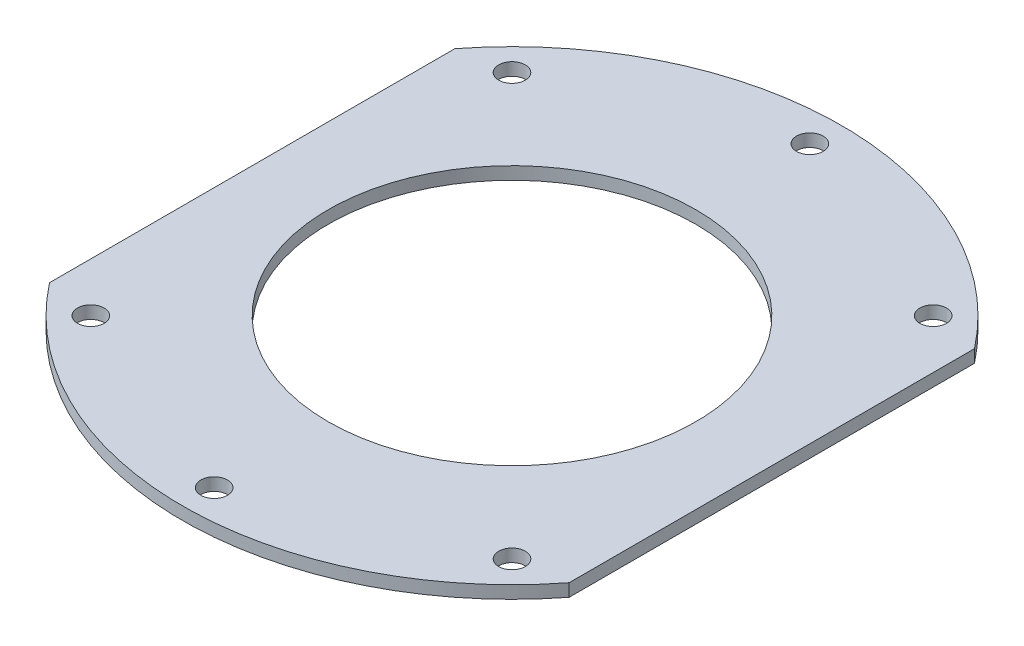
ISO-10303-21;
HEADER;
FILE_DESCRIPTION(('STEP AP214'),'2;1');
FILE_NAME('part.step','',(''),(''),'','','');
FILE_SCHEMA(('AUTOMOTIVE_DESIGN { 1 0 10303 214 1 1 1 1 }'));
ENDSEC;
DATA;
#1=APPLICATION_CONTEXT('core data for automotive mechanical design processes');
#2=APPLICATION_PROTOCOL_DEFINITION('international standard','automotive_design',2000,#1);
#3=PRODUCT_CONTEXT('',#1,'mechanical');
#4=PRODUCT('Part','Part','',(#3));
#5=PRODUCT_RELATED_PRODUCT_CATEGORY('part','',(#4));
#6=PRODUCT_DEFINITION_FORMATION('','',#4);
#7=PRODUCT_DEFINITION_CONTEXT('part definition',#1,'design');
#8=PRODUCT_DEFINITION('design','',#6,#7);
#9=PRODUCT_DEFINITION_SHAPE('','',#8);
#10=(LENGTH_UNIT() NAMED_UNIT(*) SI_UNIT(.MILLI.,.METRE.));
#11=(NAMED_UNIT(*) PLANE_ANGLE_UNIT() SI_UNIT($,.RADIAN.));
#12=(NAMED_UNIT(*) SI_UNIT($,.STERADIAN.) SOLID_ANGLE_UNIT());
#13=UNCERTAINTY_MEASURE_WITH_UNIT(LENGTH_MEASURE(1.E-05),#10,'distance_accuracy_value','');
#14=(GEOMETRIC_REPRESENTATION_CONTEXT(3) GLOBAL_UNCERTAINTY_ASSIGNED_CONTEXT((#13)) GLOBAL_UNIT_ASSIGNED_CONTEXT((#10,
#11,#12)) REPRESENTATION_CONTEXT('',''));
#15=CARTESIAN_POINT('',(0.,0.,0.));
#16=DIRECTION('',(0.,0.,1.));
#17=DIRECTION('',(1.,0.,0.));
#18=AXIS2_PLACEMENT_3D('',#15,#16,#17);
#19=CARTESIAN_POINT('',(0.,2.,0.));
#20=DIRECTION('',(0.,1.,0.));
#21=DIRECTION('',(0.,0.,1.));
#22=AXIS2_PLACEMENT_3D('',#19,#20,#21);
#23=PLANE('',#22);
#24=CARTESIAN_POINT('',(0.,2.,-47.));
#25=DIRECTION('',(0.,1.,0.));
#26=DIRECTION('',(0.,0.,1.));
#27=AXIS2_PLACEMENT_3D('',#24,#25,#26);
#28=CIRCLE('',#27,2.1);
#29=CARTESIAN_POINT('',(0.,2.,-44.9));
#30=VERTEX_POINT('',#29);
#31=EDGE_CURVE('E266',#30,#30,#28,.T.);
#32=ORIENTED_EDGE('',*,*,#31,.F.);
#33=EDGE_LOOP('',(#32));
#34=FACE_BOUND('',#33,.T.);
#35=CARTESIAN_POINT('',(0.,2.,47.));
#36=DIRECTION('',(0.,1.,0.));
#37=DIRECTION('',(0.,0.,1.));
#38=AXIS2_PLACEMENT_3D('',#35,#36,#37);
#39=CIRCLE('',#38,2.1);
#40=CARTESIAN_POINT('',(0.,2.,49.1));
#41=VERTEX_POINT('',#40);
#42=EDGE_CURVE('E284',#41,#41,#39,.T.);
#43=ORIENTED_EDGE('',*,*,#42,.F.);
#44=EDGE_LOOP('',(#43));
#45=FACE_BOUND('',#44,.T.);
#46=CARTESIAN_POINT('',(0.,2.,0.));
#47=DIRECTION('',(0.,1.,0.));
#48=DIRECTION('',(0.,0.,1.));
#49=AXIS2_PLACEMENT_3D('',#46,#47,#48);
#50=CIRCLE('',#49,29.);
#51=CARTESIAN_POINT('',(0.,2.,29.));
#52=VERTEX_POINT('',#51);
#53=EDGE_CURVE('E123',#52,#52,#50,.T.);
#54=ORIENTED_EDGE('',*,*,#53,.F.);
#55=EDGE_LOOP('',(#54));
#56=FACE_BOUND('',#55,.T.);
#57=CARTESIAN_POINT('',(33.2340187157677,2.,33.2340187157677));
#58=DIRECTION('',(0.,1.,0.));
#59=DIRECTION('',(0.,0.,1.));
#60=AXIS2_PLACEMENT_3D('',#57,#58,#59);
#61=CIRCLE('',#60,2.1);
#62=CARTESIAN_POINT('',(33.2340187157677,2.,35.3340187157677));
#63=VERTEX_POINT('',#62);
#64=EDGE_CURVE('E290',#63,#63,#61,.T.);
#65=ORIENTED_EDGE('',*,*,#64,.F.);
#66=EDGE_LOOP('',(#65));
#67=FACE_BOUND('',#66,.T.);
#68=CARTESIAN_POINT('',(-33.2340187157677,2.,33.2340187157677));
#69=DIRECTION('',(0.,1.,0.));
#70=DIRECTION('',(0.,0.,1.));
#71=AXIS2_PLACEMENT_3D('',#68,#69,#70);
#72=CIRCLE('',#71,2.1);
#73=CARTESIAN_POINT('',(-33.2340187157677,2.,35.3340187157677));
#74=VERTEX_POINT('',#73);
#75=EDGE_CURVE('E278',#74,#74,#72,.T.);
#76=ORIENTED_EDGE('',*,*,#75,.F.);
#77=EDGE_LOOP('',(#76));
#78=FACE_BOUND('',#77,.T.);
#79=CARTESIAN_POINT('',(-33.2340187157677,2.,-33.2340187157677));
#80=DIRECTION('',(0.,1.,0.));
#81=DIRECTION('',(0.,0.,1.));
#82=AXIS2_PLACEMENT_3D('',#79,#80,#81);
#83=CIRCLE('',#82,2.1);
#84=CARTESIAN_POINT('',(-33.2340187157677,2.,-31.1340187157677));
#85=VERTEX_POINT('',#84);
#86=EDGE_CURVE('E272',#85,#85,#83,.T.);
#87=ORIENTED_EDGE('',*,*,#86,.F.);
#88=EDGE_LOOP('',(#87));
#89=FACE_BOUND('',#88,.T.);
#90=CARTESIAN_POINT('',(33.2340187157677,2.,-33.2340187157677));
#91=DIRECTION('',(0.,1.,0.));
#92=DIRECTION('',(0.,0.,1.));
#93=AXIS2_PLACEMENT_3D('',#90,#91,#92);
#94=CIRCLE('',#93,2.1);
#95=CARTESIAN_POINT('',(33.2340187157677,2.,-31.1340187157677));
#96=VERTEX_POINT('',#95);
#97=EDGE_CURVE('E256',#96,#96,#94,.T.);
#98=ORIENTED_EDGE('',*,*,#97,.F.);
#99=EDGE_LOOP('',(#98));
#100=FACE_BOUND('',#99,.T.);
#101=CARTESIAN_POINT('',(0.,2.,0.));
#102=DIRECTION('',(0.,1.,0.));
#103=DIRECTION('',(0.,0.,1.));
#104=AXIS2_PLACEMENT_3D('',#101,#102,#103);
#105=CIRCLE('',#104,52.);
#106=CARTESIAN_POINT('',(-41.,2.,31.984371183439));
#107=VERTEX_POINT('',#106);
#108=CARTESIAN_POINT('',(41.,2.,31.984371183439));
#109=VERTEX_POINT('',#108);
#110=EDGE_CURVE('E109',#107,#109,#105,.T.);
#111=ORIENTED_EDGE('',*,*,#110,.T.);
#112=DIRECTION('',(0.,0.,-1.));
#113=VECTOR('',#112,1.);
#114=CARTESIAN_POINT('',(41.,2.,55.0176136765046));
#115=LINE('',#114,#113);
#116=CARTESIAN_POINT('',(41.,2.,-31.984371183439));
#117=VERTEX_POINT('',#116);
#118=EDGE_CURVE('E97',#109,#117,#115,.T.);
#119=ORIENTED_EDGE('',*,*,#118,.T.);
#120=CARTESIAN_POINT('',(-41.,2.,-31.984371183439));
#121=VERTEX_POINT('',#120);
#122=EDGE_CURVE('E113',#117,#121,#105,.T.);
#123=ORIENTED_EDGE('',*,*,#122,.T.);
#124=DIRECTION('',(0.,0.,1.));
#125=VECTOR('',#124,1.);
#126=CARTESIAN_POINT('',(-41.,2.,55.0176136765046));
#127=LINE('',#126,#125);
#128=EDGE_CURVE('E104',#121,#107,#127,.T.);
#129=ORIENTED_EDGE('',*,*,#128,.T.);
#130=EDGE_LOOP('',(#111,#119,#123,#129));
#131=FACE_BOUND('',#130,.T.);
#132=ADVANCED_FACE('F59',(#34,#45,#56,#67,#78,#89,#100,#131),#23,.T.);
#133=CARTESIAN_POINT('',(0.,0.,0.));
#134=DIRECTION('',(0.,1.,0.));
#135=DIRECTION('',(0.,0.,1.));
#136=AXIS2_PLACEMENT_3D('',#133,#134,#135);
#137=PLANE('',#136);
#138=CARTESIAN_POINT('',(0.,0.,0.));
#139=DIRECTION('',(0.,1.,0.));
#140=DIRECTION('',(0.,0.,1.));
#141=AXIS2_PLACEMENT_3D('',#138,#139,#140);
#142=CIRCLE('',#141,29.);
#143=CARTESIAN_POINT('',(0.,0.,29.));
#144=VERTEX_POINT('',#143);
#145=EDGE_CURVE('E120',#144,#144,#142,.T.);
#146=ORIENTED_EDGE('',*,*,#145,.T.);
#147=EDGE_LOOP('',(#146));
#148=FACE_BOUND('',#147,.T.);
#149=CARTESIAN_POINT('',(33.2340187157677,0.,33.2340187157677));
#150=DIRECTION('',(0.,1.,0.));
#151=DIRECTION('',(0.,0.,1.));
#152=AXIS2_PLACEMENT_3D('',#149,#150,#151);
#153=CIRCLE('',#152,2.1);
#154=CARTESIAN_POINT('',(33.2340187157677,0.,35.3340187157677));
#155=VERTEX_POINT('',#154);
#156=EDGE_CURVE('E287',#155,#155,#153,.T.);
#157=ORIENTED_EDGE('',*,*,#156,.T.);
#158=EDGE_LOOP('',(#157));
#159=FACE_BOUND('',#158,.T.);
#160=CARTESIAN_POINT('',(0.,0.,47.));
#161=DIRECTION('',(0.,1.,0.));
#162=DIRECTION('',(0.,0.,1.));
#163=AXIS2_PLACEMENT_3D('',#160,#161,#162);
#164=CIRCLE('',#163,2.1);
#165=CARTESIAN_POINT('',(0.,0.,49.1));
#166=VERTEX_POINT('',#165);
#167=EDGE_CURVE('E281',#166,#166,#164,.T.);
#168=ORIENTED_EDGE('',*,*,#167,.T.);
#169=EDGE_LOOP('',(#168));
#170=FACE_BOUND('',#169,.T.);
#171=CARTESIAN_POINT('',(-33.2340187157677,0.,33.2340187157677));
#172=DIRECTION('',(0.,1.,0.));
#173=DIRECTION('',(0.,0.,1.));
#174=AXIS2_PLACEMENT_3D('',#171,#172,#173);
#175=CIRCLE('',#174,2.1);
#176=CARTESIAN_POINT('',(-33.2340187157677,0.,35.3340187157677));
#177=VERTEX_POINT('',#176);
#178=EDGE_CURVE('E275',#177,#177,#175,.T.);
#179=ORIENTED_EDGE('',*,*,#178,.T.);
#180=EDGE_LOOP('',(#179));
#181=FACE_BOUND('',#180,.T.);
#182=CARTESIAN_POINT('',(-33.2340187157677,0.,-33.2340187157677));
#183=DIRECTION('',(0.,1.,0.));
#184=DIRECTION('',(0.,0.,1.));
#185=AXIS2_PLACEMENT_3D('',#182,#183,#184);
#186=CIRCLE('',#185,2.1);
#187=CARTESIAN_POINT('',(-33.2340187157677,0.,-31.1340187157677));
#188=VERTEX_POINT('',#187);
#189=EDGE_CURVE('E269',#188,#188,#186,.T.);
#190=ORIENTED_EDGE('',*,*,#189,.T.);
#191=EDGE_LOOP('',(#190));
#192=FACE_BOUND('',#191,.T.);
#193=CARTESIAN_POINT('',(0.,0.,-47.));
#194=DIRECTION('',(0.,1.,0.));
#195=DIRECTION('',(0.,0.,1.));
#196=AXIS2_PLACEMENT_3D('',#193,#194,#195);
#197=CIRCLE('',#196,2.1);
#198=CARTESIAN_POINT('',(0.,0.,-44.9));
#199=VERTEX_POINT('',#198);
#200=EDGE_CURVE('E262',#199,#199,#197,.T.);
#201=ORIENTED_EDGE('',*,*,#200,.T.);
#202=EDGE_LOOP('',(#201));
#203=FACE_BOUND('',#202,.T.);
#204=CARTESIAN_POINT('',(33.2340187157677,0.,-33.2340187157677));
#205=DIRECTION('',(0.,1.,0.));
#206=DIRECTION('',(0.,0.,1.));
#207=AXIS2_PLACEMENT_3D('',#204,#205,#206);
#208=CIRCLE('',#207,2.1);
#209=CARTESIAN_POINT('',(33.2340187157677,0.,-31.1340187157677));
#210=VERTEX_POINT('',#209);
#211=EDGE_CURVE('E259',#210,#210,#208,.T.);
#212=ORIENTED_EDGE('',*,*,#211,.T.);
#213=EDGE_LOOP('',(#212));
#214=FACE_BOUND('',#213,.T.);
#215=DIRECTION('',(0.,0.,-1.));
#216=VECTOR('',#215,1.);
#217=CARTESIAN_POINT('',(41.,0.,0.));
#218=LINE('',#217,#216);
#219=CARTESIAN_POINT('',(41.,0.,31.984371183439));
#220=VERTEX_POINT('',#219);
#221=CARTESIAN_POINT('',(41.,0.,-31.984371183439));
#222=VERTEX_POINT('',#221);
#223=EDGE_CURVE('E81',#220,#222,#218,.T.);
#224=ORIENTED_EDGE('',*,*,#223,.F.);
#225=CARTESIAN_POINT('',(0.,0.,0.));
#226=DIRECTION('',(0.,1.,0.));
#227=DIRECTION('',(0.,0.,1.));
#228=AXIS2_PLACEMENT_3D('',#225,#226,#227);
#229=CIRCLE('',#228,52.);
#230=CARTESIAN_POINT('',(-41.,0.,31.984371183439));
#231=VERTEX_POINT('',#230);
#232=EDGE_CURVE('E111',#231,#220,#229,.T.);
#233=ORIENTED_EDGE('',*,*,#232,.F.);
#234=DIRECTION('',(0.,0.,1.));
#235=VECTOR('',#234,1.);
#236=CARTESIAN_POINT('',(-41.,0.,0.));
#237=LINE('',#236,#235);
#238=CARTESIAN_POINT('',(-41.,0.,-31.984371183439));
#239=VERTEX_POINT('',#238);
#240=EDGE_CURVE('E74',#239,#231,#237,.T.);
#241=ORIENTED_EDGE('',*,*,#240,.F.);
#242=EDGE_CURVE('E114',#222,#239,#229,.T.);
#243=ORIENTED_EDGE('',*,*,#242,.F.);
#244=EDGE_LOOP('',(#224,#233,#241,#243));
#245=FACE_BOUND('',#244,.T.);
#246=ADVANCED_FACE('F131',(#148,#159,#170,#181,#192,#203,#214,#245),#137,.F.);
#247=CARTESIAN_POINT('',(0.,2.,0.));
#248=DIRECTION('',(0.,-1.,0.));
#249=DIRECTION('',(0.,0.,-1.));
#250=AXIS2_PLACEMENT_3D('',#247,#248,#249);
#251=CYLINDRICAL_SURFACE('',#250,52.);
#252=DIRECTION('',(0.,-1.,0.));
#253=VECTOR('',#252,1.);
#254=CARTESIAN_POINT('',(41.,2.,31.984371183439));
#255=LINE('',#254,#253);
#256=EDGE_CURVE('E12',#109,#220,#255,.T.);
#257=ORIENTED_EDGE('',*,*,#256,.F.);
#258=ORIENTED_EDGE('',*,*,#110,.F.);
#259=DIRECTION('',(0.,-1.,0.));
#260=VECTOR('',#259,1.);
#261=CARTESIAN_POINT('',(-41.,2.,31.984371183439));
#262=LINE('',#261,#260);
#263=EDGE_CURVE('E116',#231,#107,#262,.F.);
#264=ORIENTED_EDGE('',*,*,#263,.F.);
#265=ORIENTED_EDGE('',*,*,#232,.T.);
#266=EDGE_LOOP('',(#257,#258,#264,#265));
#267=FACE_BOUND('',#266,.T.);
#268=ADVANCED_FACE('F61',(#267),#251,.T.);
#269=DIRECTION('',(0.,-1.,0.));
#270=VECTOR('',#269,1.);
#271=CARTESIAN_POINT('',(41.,2.,-31.984371183439));
#272=LINE('',#271,#270);
#273=EDGE_CURVE('E67',#222,#117,#272,.F.);
#274=ORIENTED_EDGE('',*,*,#273,.F.);
#275=ORIENTED_EDGE('',*,*,#242,.T.);
#276=DIRECTION('',(0.,-1.,0.));
#277=VECTOR('',#276,1.);
#278=CARTESIAN_POINT('',(-41.,2.,-31.984371183439));
#279=LINE('',#278,#277);
#280=EDGE_CURVE('E125',#121,#239,#279,.T.);
#281=ORIENTED_EDGE('',*,*,#280,.F.);
#282=ORIENTED_EDGE('',*,*,#122,.F.);
#283=EDGE_LOOP('',(#274,#275,#281,#282));
#284=FACE_BOUND('',#283,.T.);
#285=ADVANCED_FACE('F133',(#284),#251,.T.);
#286=CARTESIAN_POINT('',(0.,2.,0.));
#287=DIRECTION('',(0.,-1.,0.));
#288=DIRECTION('',(0.,0.,-1.));
#289=AXIS2_PLACEMENT_3D('',#286,#287,#288);
#290=CYLINDRICAL_SURFACE('',#289,29.);
#291=ORIENTED_EDGE('',*,*,#53,.T.);
#292=EDGE_LOOP('',(#291));
#293=FACE_BOUND('',#292,.T.);
#294=ORIENTED_EDGE('',*,*,#145,.F.);
#295=EDGE_LOOP('',(#294));
#296=FACE_BOUND('',#295,.T.);
#297=ADVANCED_FACE('F135',(#293,#296),#290,.F.);
#298=CARTESIAN_POINT('',(33.2340187157677,2.,33.2340187157677));
#299=DIRECTION('',(0.,-1.,0.));
#300=DIRECTION('',(0.,0.,-1.));
#301=AXIS2_PLACEMENT_3D('',#298,#299,#300);
#302=CYLINDRICAL_SURFACE('',#301,2.1);
#303=ORIENTED_EDGE('',*,*,#64,.T.);
#304=EDGE_LOOP('',(#303));
#305=FACE_BOUND('',#304,.T.);
#306=ORIENTED_EDGE('',*,*,#156,.F.);
#307=EDGE_LOOP('',(#306));
#308=FACE_BOUND('',#307,.T.);
#309=ADVANCED_FACE('F140',(#305,#308),#302,.F.);
#310=CARTESIAN_POINT('',(0.,2.,47.));
#311=DIRECTION('',(0.,-1.,0.));
#312=DIRECTION('',(0.,0.,-1.));
#313=AXIS2_PLACEMENT_3D('',#310,#311,#312);
#314=CYLINDRICAL_SURFACE('',#313,2.1);
#315=ORIENTED_EDGE('',*,*,#42,.T.);
#316=EDGE_LOOP('',(#315));
#317=FACE_BOUND('',#316,.T.);
#318=ORIENTED_EDGE('',*,*,#167,.F.);
#319=EDGE_LOOP('',(#318));
#320=FACE_BOUND('',#319,.T.);
#321=ADVANCED_FACE('F155',(#317,#320),#314,.F.);
#322=CARTESIAN_POINT('',(-33.2340187157677,2.,33.2340187157677));
#323=DIRECTION('',(0.,-1.,0.));
#324=DIRECTION('',(0.,0.,-1.));
#325=AXIS2_PLACEMENT_3D('',#322,#323,#324);
#326=CYLINDRICAL_SURFACE('',#325,2.1);
#327=ORIENTED_EDGE('',*,*,#75,.T.);
#328=EDGE_LOOP('',(#327));
#329=FACE_BOUND('',#328,.T.);
#330=ORIENTED_EDGE('',*,*,#178,.F.);
#331=EDGE_LOOP('',(#330));
#332=FACE_BOUND('',#331,.T.);
#333=ADVANCED_FACE('F159',(#329,#332),#326,.F.);
#334=CARTESIAN_POINT('',(-33.2340187157677,2.,-33.2340187157677));
#335=DIRECTION('',(0.,-1.,0.));
#336=DIRECTION('',(0.,0.,-1.));
#337=AXIS2_PLACEMENT_3D('',#334,#335,#336);
#338=CYLINDRICAL_SURFACE('',#337,2.1);
#339=ORIENTED_EDGE('',*,*,#86,.T.);
#340=EDGE_LOOP('',(#339));
#341=FACE_BOUND('',#340,.T.);
#342=ORIENTED_EDGE('',*,*,#189,.F.);
#343=EDGE_LOOP('',(#342));
#344=FACE_BOUND('',#343,.T.);
#345=ADVANCED_FACE('F163',(#341,#344),#338,.F.);
#346=CARTESIAN_POINT('',(0.,2.,-47.));
#347=DIRECTION('',(0.,-1.,0.));
#348=DIRECTION('',(0.,0.,-1.));
#349=AXIS2_PLACEMENT_3D('',#346,#347,#348);
#350=CYLINDRICAL_SURFACE('',#349,2.1);
#351=ORIENTED_EDGE('',*,*,#31,.T.);
#352=EDGE_LOOP('',(#351));
#353=FACE_BOUND('',#352,.T.);
#354=ORIENTED_EDGE('',*,*,#200,.F.);
#355=EDGE_LOOP('',(#354));
#356=FACE_BOUND('',#355,.T.);
#357=ADVANCED_FACE('F167',(#353,#356),#350,.F.);
#358=CARTESIAN_POINT('',(33.2340187157677,2.,-33.2340187157677));
#359=DIRECTION('',(0.,-1.,0.));
#360=DIRECTION('',(0.,0.,-1.));
#361=AXIS2_PLACEMENT_3D('',#358,#359,#360);
#362=CYLINDRICAL_SURFACE('',#361,2.1);
#363=ORIENTED_EDGE('',*,*,#97,.T.);
#364=EDGE_LOOP('',(#363));
#365=FACE_BOUND('',#364,.T.);
#366=ORIENTED_EDGE('',*,*,#211,.F.);
#367=EDGE_LOOP('',(#366));
#368=FACE_BOUND('',#367,.T.);
#369=ADVANCED_FACE('F171',(#365,#368),#362,.F.);
#370=CARTESIAN_POINT('',(-41.,-8.,55.0176136765046));
#371=DIRECTION('',(-1.,0.,0.));
#372=DIRECTION('',(0.,0.,1.));
#373=AXIS2_PLACEMENT_3D('',#370,#371,#372);
#374=PLANE('',#373);
#375=ORIENTED_EDGE('',*,*,#280,.T.);
#376=ORIENTED_EDGE('',*,*,#240,.T.);
#377=ORIENTED_EDGE('',*,*,#263,.T.);
#378=ORIENTED_EDGE('',*,*,#128,.F.);
#379=EDGE_LOOP('',(#375,#376,#377,#378));
#380=FACE_BOUND('',#379,.T.);
#381=ADVANCED_FACE('F127',(#380),#374,.T.);
#382=CARTESIAN_POINT('',(41.,-8.,55.0176136765046));
#383=DIRECTION('',(1.,0.,0.));
#384=DIRECTION('',(0.,0.,-1.));
#385=AXIS2_PLACEMENT_3D('',#382,#383,#384);
#386=PLANE('',#385);
#387=ORIENTED_EDGE('',*,*,#256,.T.);
#388=ORIENTED_EDGE('',*,*,#223,.T.);
#389=ORIENTED_EDGE('',*,*,#273,.T.);
#390=ORIENTED_EDGE('',*,*,#118,.F.);
#391=EDGE_LOOP('',(#387,#388,#389,#390));
#392=FACE_BOUND('',#391,.T.);
#393=ADVANCED_FACE('F99',(#392),#386,.T.);
#394=CLOSED_SHELL('',(#132,#246,#268,#285,#297,#309,#321,#333,#345,#357,#369,#381,#393));
#395=MANIFOLD_SOLID_BREP('B2',#394);
#396=ADVANCED_BREP_SHAPE_REPRESENTATION('',(#18,#395),#14);
#397=SHAPE_DEFINITION_REPRESENTATION(#9,#396);
ENDSEC;
END-ISO-10303-21;
